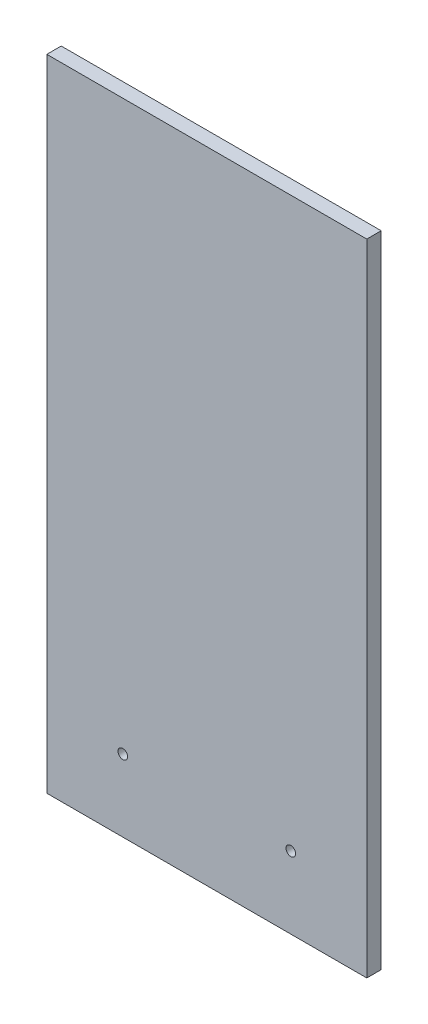
ISO-10303-21;
HEADER;
FILE_DESCRIPTION(('STEP AP214'),'2;1');
FILE_NAME('part.step','',(''),(''),'','','');
FILE_SCHEMA(('AUTOMOTIVE_DESIGN { 1 0 10303 214 1 1 1 1 }'));
ENDSEC;
DATA;
#1=APPLICATION_CONTEXT('core data for automotive mechanical design processes');
#2=APPLICATION_PROTOCOL_DEFINITION('international standard','automotive_design',2000,#1);
#3=PRODUCT_CONTEXT('',#1,'mechanical');
#4=PRODUCT('Part','Part','',(#3));
#5=PRODUCT_RELATED_PRODUCT_CATEGORY('part','',(#4));
#6=PRODUCT_DEFINITION_FORMATION('','',#4);
#7=PRODUCT_DEFINITION_CONTEXT('part definition',#1,'design');
#8=PRODUCT_DEFINITION('design','',#6,#7);
#9=PRODUCT_DEFINITION_SHAPE('','',#8);
#10=(LENGTH_UNIT() NAMED_UNIT(*) SI_UNIT(.MILLI.,.METRE.));
#11=(NAMED_UNIT(*) PLANE_ANGLE_UNIT() SI_UNIT($,.RADIAN.));
#12=(NAMED_UNIT(*) SI_UNIT($,.STERADIAN.) SOLID_ANGLE_UNIT());
#13=UNCERTAINTY_MEASURE_WITH_UNIT(LENGTH_MEASURE(1.E-05),#10,'distance_accuracy_value','');
#14=(GEOMETRIC_REPRESENTATION_CONTEXT(3) GLOBAL_UNCERTAINTY_ASSIGNED_CONTEXT((#13)) GLOBAL_UNIT_ASSIGNED_CONTEXT((#10,
#11,#12)) REPRESENTATION_CONTEXT('',''));
#15=CARTESIAN_POINT('',(0.,0.,0.));
#16=DIRECTION('',(0.,0.,1.));
#17=DIRECTION('',(1.,0.,0.));
#18=AXIS2_PLACEMENT_3D('',#15,#16,#17);
#19=CARTESIAN_POINT('',(0.,0.,18.));
#20=DIRECTION('',(1.,0.,0.));
#21=DIRECTION('',(0.,0.,-1.));
#22=AXIS2_PLACEMENT_3D('',#19,#20,#21);
#23=PLANE('',#22);
#24=DIRECTION('',(0.,-1.,0.));
#25=VECTOR('',#24,1.);
#26=CARTESIAN_POINT('',(0.,0.,0.));
#27=LINE('',#26,#25);
#28=CARTESIAN_POINT('',(0.,800.,0.));
#29=VERTEX_POINT('',#28);
#30=CARTESIAN_POINT('',(0.,0.,0.));
#31=VERTEX_POINT('',#30);
#32=EDGE_CURVE('E98',#29,#31,#27,.T.);
#33=ORIENTED_EDGE('',*,*,#32,.T.);
#34=DIRECTION('',(0.,0.,-1.));
#35=VECTOR('',#34,1.);
#36=CARTESIAN_POINT('',(0.,0.,18.));
#37=LINE('',#36,#35);
#38=CARTESIAN_POINT('',(0.,0.,18.));
#39=VERTEX_POINT('',#38);
#40=EDGE_CURVE('E11',#39,#31,#37,.T.);
#41=ORIENTED_EDGE('',*,*,#40,.F.);
#42=DIRECTION('',(0.,-1.,0.));
#43=VECTOR('',#42,1.);
#44=CARTESIAN_POINT('',(0.,0.,18.));
#45=LINE('',#44,#43);
#46=CARTESIAN_POINT('',(0.,800.,18.));
#47=VERTEX_POINT('',#46);
#48=EDGE_CURVE('E86',#47,#39,#45,.T.);
#49=ORIENTED_EDGE('',*,*,#48,.F.);
#50=DIRECTION('',(0.,0.,-1.));
#51=VECTOR('',#50,1.);
#52=CARTESIAN_POINT('',(0.,800.,18.));
#53=LINE('',#52,#51);
#54=EDGE_CURVE('E94',#47,#29,#53,.T.);
#55=ORIENTED_EDGE('',*,*,#54,.T.);
#56=EDGE_LOOP('',(#33,#41,#49,#55));
#57=FACE_BOUND('',#56,.T.);
#58=ADVANCED_FACE('F35',(#57),#23,.F.);
#59=CARTESIAN_POINT('',(0.,0.,18.));
#60=DIRECTION('',(0.,1.,0.));
#61=DIRECTION('',(0.,0.,1.));
#62=AXIS2_PLACEMENT_3D('',#59,#60,#61);
#63=PLANE('',#62);
#64=DIRECTION('',(1.,0.,0.));
#65=VECTOR('',#64,1.);
#66=CARTESIAN_POINT('',(0.,0.,0.));
#67=LINE('',#66,#65);
#68=CARTESIAN_POINT('',(400.,0.,0.));
#69=VERTEX_POINT('',#68);
#70=EDGE_CURVE('E90',#31,#69,#67,.T.);
#71=ORIENTED_EDGE('',*,*,#70,.T.);
#72=DIRECTION('',(0.,0.,-1.));
#73=VECTOR('',#72,1.);
#74=CARTESIAN_POINT('',(400.,0.,18.));
#75=LINE('',#74,#73);
#76=CARTESIAN_POINT('',(400.,0.,18.));
#77=VERTEX_POINT('',#76);
#78=EDGE_CURVE('E43',#77,#69,#75,.T.);
#79=ORIENTED_EDGE('',*,*,#78,.F.);
#80=DIRECTION('',(1.,0.,0.));
#81=VECTOR('',#80,1.);
#82=CARTESIAN_POINT('',(0.,0.,18.));
#83=LINE('',#82,#81);
#84=EDGE_CURVE('E81',#39,#77,#83,.T.);
#85=ORIENTED_EDGE('',*,*,#84,.F.);
#86=ORIENTED_EDGE('',*,*,#40,.T.);
#87=EDGE_LOOP('',(#71,#79,#85,#86));
#88=FACE_BOUND('',#87,.T.);
#89=ADVANCED_FACE('F89',(#88),#63,.F.);
#90=CARTESIAN_POINT('',(400.,0.,18.));
#91=DIRECTION('',(-1.,0.,0.));
#92=DIRECTION('',(0.,0.,1.));
#93=AXIS2_PLACEMENT_3D('',#90,#91,#92);
#94=PLANE('',#93);
#95=DIRECTION('',(0.,1.,0.));
#96=VECTOR('',#95,1.);
#97=CARTESIAN_POINT('',(400.,0.,0.));
#98=LINE('',#97,#96);
#99=CARTESIAN_POINT('',(400.,800.,0.));
#100=VERTEX_POINT('',#99);
#101=EDGE_CURVE('E68',#69,#100,#98,.T.);
#102=ORIENTED_EDGE('',*,*,#101,.T.);
#103=DIRECTION('',(0.,0.,-1.));
#104=VECTOR('',#103,1.);
#105=CARTESIAN_POINT('',(400.,800.,18.));
#106=LINE('',#105,#104);
#107=CARTESIAN_POINT('',(400.,800.,18.));
#108=VERTEX_POINT('',#107);
#109=EDGE_CURVE('E91',#108,#100,#106,.T.);
#110=ORIENTED_EDGE('',*,*,#109,.F.);
#111=DIRECTION('',(0.,1.,0.));
#112=VECTOR('',#111,1.);
#113=CARTESIAN_POINT('',(400.,0.,18.));
#114=LINE('',#113,#112);
#115=EDGE_CURVE('E84',#77,#108,#114,.T.);
#116=ORIENTED_EDGE('',*,*,#115,.F.);
#117=ORIENTED_EDGE('',*,*,#78,.T.);
#118=EDGE_LOOP('',(#102,#110,#116,#117));
#119=FACE_BOUND('',#118,.T.);
#120=ADVANCED_FACE('F92',(#119),#94,.F.);
#121=CARTESIAN_POINT('',(0.,800.,18.));
#122=DIRECTION('',(0.,-1.,0.));
#123=DIRECTION('',(0.,0.,-1.));
#124=AXIS2_PLACEMENT_3D('',#121,#122,#123);
#125=PLANE('',#124);
#126=DIRECTION('',(-1.,0.,0.));
#127=VECTOR('',#126,1.);
#128=CARTESIAN_POINT('',(0.,800.,0.));
#129=LINE('',#128,#127);
#130=EDGE_CURVE('E74',#100,#29,#129,.T.);
#131=ORIENTED_EDGE('',*,*,#130,.T.);
#132=ORIENTED_EDGE('',*,*,#54,.F.);
#133=DIRECTION('',(-1.,0.,0.));
#134=VECTOR('',#133,1.);
#135=CARTESIAN_POINT('',(0.,800.,18.));
#136=LINE('',#135,#134);
#137=EDGE_CURVE('E51',#108,#47,#136,.T.);
#138=ORIENTED_EDGE('',*,*,#137,.F.);
#139=ORIENTED_EDGE('',*,*,#109,.T.);
#140=EDGE_LOOP('',(#131,#132,#138,#139));
#141=FACE_BOUND('',#140,.T.);
#142=ADVANCED_FACE('F106',(#141),#125,.F.);
#143=CARTESIAN_POINT('',(0.,0.,18.));
#144=DIRECTION('',(0.,0.,-1.));
#145=DIRECTION('',(-1.,0.,0.));
#146=AXIS2_PLACEMENT_3D('',#143,#144,#145);
#147=PLANE('',#146);
#148=CARTESIAN_POINT('',(95.,90.,18.));
#149=DIRECTION('',(0.,0.,-1.));
#150=DIRECTION('',(-1.,0.,0.));
#151=AXIS2_PLACEMENT_3D('',#148,#149,#150);
#152=CIRCLE('',#151,6.);
#153=CARTESIAN_POINT('',(89.,90.,18.));
#154=VERTEX_POINT('',#153);
#155=EDGE_CURVE('E101',#154,#154,#152,.T.);
#156=ORIENTED_EDGE('',*,*,#155,.T.);
#157=EDGE_LOOP('',(#156));
#158=FACE_BOUND('',#157,.T.);
#159=CARTESIAN_POINT('',(305.,90.,18.));
#160=DIRECTION('',(0.,0.,-1.));
#161=DIRECTION('',(-1.,0.,0.));
#162=AXIS2_PLACEMENT_3D('',#159,#160,#161);
#163=CIRCLE('',#162,5.99999999999999);
#164=CARTESIAN_POINT('',(299.,90.,18.));
#165=VERTEX_POINT('',#164);
#166=EDGE_CURVE('E114',#165,#165,#163,.T.);
#167=ORIENTED_EDGE('',*,*,#166,.T.);
#168=EDGE_LOOP('',(#167));
#169=FACE_BOUND('',#168,.T.);
#170=ORIENTED_EDGE('',*,*,#48,.T.);
#171=ORIENTED_EDGE('',*,*,#84,.T.);
#172=ORIENTED_EDGE('',*,*,#115,.T.);
#173=ORIENTED_EDGE('',*,*,#137,.T.);
#174=EDGE_LOOP('',(#170,#171,#172,#173));
#175=FACE_BOUND('',#174,.T.);
#176=ADVANCED_FACE('F82',(#158,#169,#175),#147,.F.);
#177=CARTESIAN_POINT('',(0.,0.,0.));
#178=DIRECTION('',(0.,0.,-1.));
#179=DIRECTION('',(-1.,0.,0.));
#180=AXIS2_PLACEMENT_3D('',#177,#178,#179);
#181=PLANE('',#180);
#182=CARTESIAN_POINT('',(95.,90.,0.));
#183=DIRECTION('',(0.,0.,1.));
#184=DIRECTION('',(1.,0.,0.));
#185=AXIS2_PLACEMENT_3D('',#182,#183,#184);
#186=CIRCLE('',#185,6.);
#187=CARTESIAN_POINT('',(101.,90.,0.));
#188=VERTEX_POINT('',#187);
#189=EDGE_CURVE('E117',#188,#188,#186,.T.);
#190=ORIENTED_EDGE('',*,*,#189,.T.);
#191=EDGE_LOOP('',(#190));
#192=FACE_BOUND('',#191,.T.);
#193=CARTESIAN_POINT('',(305.,90.,0.));
#194=DIRECTION('',(0.,0.,1.));
#195=DIRECTION('',(-1.,0.,0.));
#196=AXIS2_PLACEMENT_3D('',#193,#194,#195);
#197=CIRCLE('',#196,5.99999999999999);
#198=CARTESIAN_POINT('',(299.,90.,0.));
#199=VERTEX_POINT('',#198);
#200=EDGE_CURVE('E118',#199,#199,#197,.T.);
#201=ORIENTED_EDGE('',*,*,#200,.T.);
#202=EDGE_LOOP('',(#201));
#203=FACE_BOUND('',#202,.T.);
#204=ORIENTED_EDGE('',*,*,#32,.F.);
#205=ORIENTED_EDGE('',*,*,#130,.F.);
#206=ORIENTED_EDGE('',*,*,#101,.F.);
#207=ORIENTED_EDGE('',*,*,#70,.F.);
#208=EDGE_LOOP('',(#204,#205,#206,#207));
#209=FACE_BOUND('',#208,.T.);
#210=ADVANCED_FACE('F109',(#192,#203,#209),#181,.T.);
#211=CARTESIAN_POINT('',(305.,90.,0.));
#212=DIRECTION('',(0.,0.,1.));
#213=DIRECTION('',(1.,0.,0.));
#214=AXIS2_PLACEMENT_3D('',#211,#212,#213);
#215=CYLINDRICAL_SURFACE('',#214,5.99999999999999);
#216=ORIENTED_EDGE('',*,*,#200,.F.);
#217=EDGE_LOOP('',(#216));
#218=FACE_BOUND('',#217,.T.);
#219=ORIENTED_EDGE('',*,*,#166,.F.);
#220=EDGE_LOOP('',(#219));
#221=FACE_BOUND('',#220,.T.);
#222=ADVANCED_FACE('F129',(#218,#221),#215,.F.);
#223=CARTESIAN_POINT('',(95.,90.,0.));
#224=DIRECTION('',(0.,0.,1.));
#225=DIRECTION('',(1.,0.,0.));
#226=AXIS2_PLACEMENT_3D('',#223,#224,#225);
#227=CYLINDRICAL_SURFACE('',#226,6.);
#228=ORIENTED_EDGE('',*,*,#189,.F.);
#229=EDGE_LOOP('',(#228));
#230=FACE_BOUND('',#229,.T.);
#231=ORIENTED_EDGE('',*,*,#155,.F.);
#232=EDGE_LOOP('',(#231));
#233=FACE_BOUND('',#232,.T.);
#234=ADVANCED_FACE('F126',(#230,#233),#227,.F.);
#235=CLOSED_SHELL('',(#58,#89,#120,#142,#176,#210,#222,#234));
#236=MANIFOLD_SOLID_BREP('B2',#235);
#237=ADVANCED_BREP_SHAPE_REPRESENTATION('',(#18,#236),#14);
#238=SHAPE_DEFINITION_REPRESENTATION(#9,#237);
ENDSEC;
END-ISO-10303-21;
